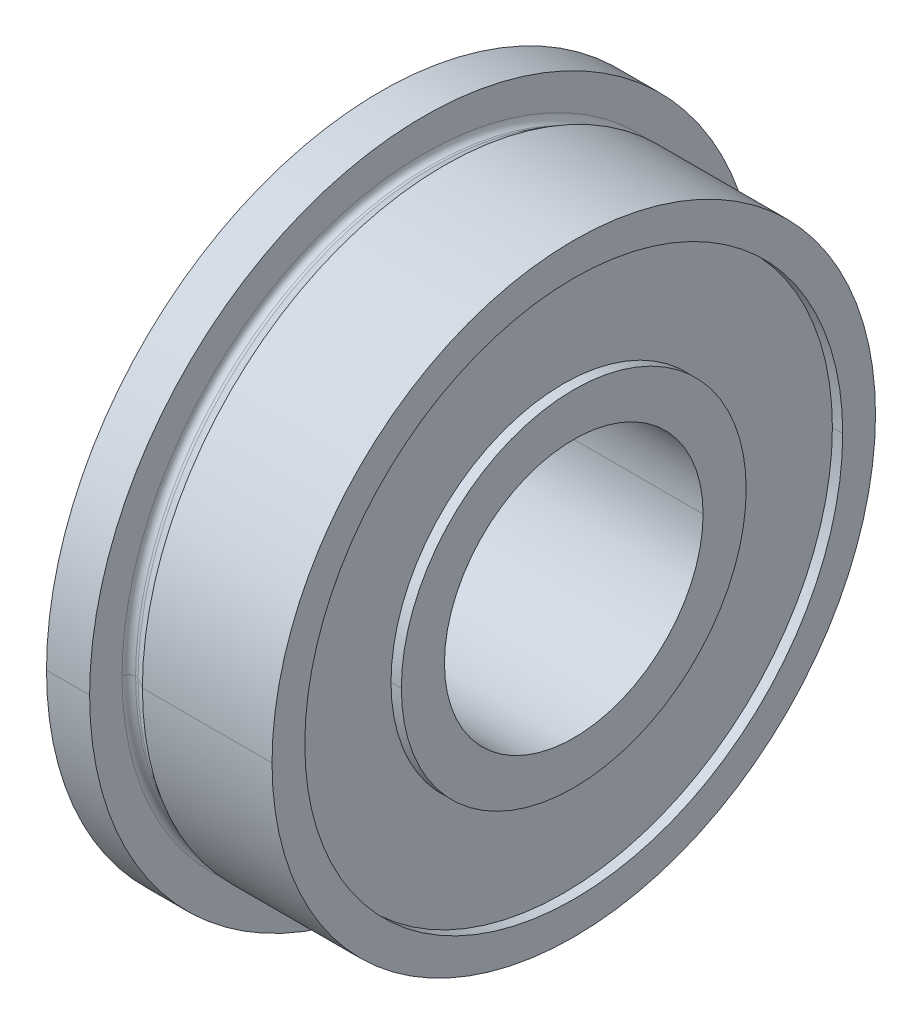
ISO-10303-21;
HEADER;
FILE_DESCRIPTION(('STEP AP214'),'2;1');
FILE_NAME('part.step','',(''),(''),'','','');
FILE_SCHEMA(('AUTOMOTIVE_DESIGN { 1 0 10303 214 1 1 1 1 }'));
ENDSEC;
DATA;
#1=APPLICATION_CONTEXT('core data for automotive mechanical design processes');
#2=APPLICATION_PROTOCOL_DEFINITION('international standard','automotive_design',2000,#1);
#3=PRODUCT_CONTEXT('',#1,'mechanical');
#4=PRODUCT('Part','Part','',(#3));
#5=PRODUCT_RELATED_PRODUCT_CATEGORY('part','',(#4));
#6=PRODUCT_DEFINITION_FORMATION('','',#4);
#7=PRODUCT_DEFINITION_CONTEXT('part definition',#1,'design');
#8=PRODUCT_DEFINITION('design','',#6,#7);
#9=PRODUCT_DEFINITION_SHAPE('','',#8);
#10=(LENGTH_UNIT() NAMED_UNIT(*) SI_UNIT(.MILLI.,.METRE.));
#11=(NAMED_UNIT(*) PLANE_ANGLE_UNIT() SI_UNIT($,.RADIAN.));
#12=(NAMED_UNIT(*) SI_UNIT($,.STERADIAN.) SOLID_ANGLE_UNIT());
#13=UNCERTAINTY_MEASURE_WITH_UNIT(LENGTH_MEASURE(1.E-05),#10,'distance_accuracy_value','');
#14=(GEOMETRIC_REPRESENTATION_CONTEXT(3) GLOBAL_UNCERTAINTY_ASSIGNED_CONTEXT((#13)) GLOBAL_UNIT_ASSIGNED_CONTEXT((#10,
#11,#12)) REPRESENTATION_CONTEXT('',''));
#15=CARTESIAN_POINT('',(0.,0.,0.));
#16=DIRECTION('',(0.,0.,1.));
#17=DIRECTION('',(1.,0.,0.));
#18=AXIS2_PLACEMENT_3D('',#15,#16,#17);
#19=CARTESIAN_POINT('',(1.8375,0.,0.));
#20=DIRECTION('',(-1.,0.,0.));
#21=DIRECTION('',(0.,0.,1.));
#22=AXIS2_PLACEMENT_3D('',#19,#20,#21);
#23=TOROIDAL_SURFACE('',#22,11.1125,0.25);
#24=CARTESIAN_POINT('',(1.8375,0.,11.1125));
#25=DIRECTION('',(0.,-1.,0.));
#26=DIRECTION('',(0.,0.,-1.));
#27=AXIS2_PLACEMENT_3D('',#24,#25,#26);
#28=CIRCLE('',#27,0.25);
#29=CARTESIAN_POINT('',(1.5875,0.,11.1125));
#30=VERTEX_POINT('',#29);
#31=CARTESIAN_POINT('',(1.8375,0.,10.8625));
#32=VERTEX_POINT('',#31);
#33=EDGE_CURVE('E11',#30,#32,#28,.T.);
#34=ORIENTED_EDGE('',*,*,#33,.T.);
#35=CARTESIAN_POINT('',(1.8375,0.,0.));
#36=DIRECTION('',(-1.,0.,0.));
#37=DIRECTION('',(0.,0.,1.));
#38=AXIS2_PLACEMENT_3D('',#35,#36,#37);
#39=CIRCLE('',#38,10.8625);
#40=CARTESIAN_POINT('',(1.8375,0.,-10.8625));
#41=VERTEX_POINT('',#40);
#42=EDGE_CURVE('E28',#32,#41,#39,.T.);
#43=ORIENTED_EDGE('',*,*,#42,.T.);
#44=CARTESIAN_POINT('',(1.8375,0.,-11.1125));
#45=DIRECTION('',(0.,1.,0.));
#46=DIRECTION('',(0.,0.,1.));
#47=AXIS2_PLACEMENT_3D('',#44,#45,#46);
#48=CIRCLE('',#47,0.25);
#49=CARTESIAN_POINT('',(1.5875,0.,-11.1125));
#50=VERTEX_POINT('',#49);
#51=EDGE_CURVE('E260',#50,#41,#48,.T.);
#52=ORIENTED_EDGE('',*,*,#51,.F.);
#53=CARTESIAN_POINT('',(1.5875,0.,0.));
#54=DIRECTION('',(-1.,0.,0.));
#55=DIRECTION('',(0.,0.,1.));
#56=AXIS2_PLACEMENT_3D('',#53,#54,#55);
#57=CIRCLE('',#56,11.1125);
#58=EDGE_CURVE('E230',#30,#50,#57,.T.);
#59=ORIENTED_EDGE('',*,*,#58,.F.);
#60=EDGE_LOOP('',(#34,#43,#52,#59));
#61=FACE_BOUND('',#60,.T.);
#62=ADVANCED_FACE('F17',(#61),#23,.F.);
#63=CARTESIAN_POINT('',(1.8375,0.,0.));
#64=DIRECTION('',(-1.,0.,0.));
#65=DIRECTION('',(0.,0.,1.));
#66=AXIS2_PLACEMENT_3D('',#63,#64,#65);
#67=TOROIDAL_SURFACE('',#66,11.1125,0.25);
#68=ORIENTED_EDGE('',*,*,#51,.T.);
#69=CARTESIAN_POINT('',(1.8375,0.,0.));
#70=DIRECTION('',(-1.,0.,0.));
#71=DIRECTION('',(0.,0.,1.));
#72=AXIS2_PLACEMENT_3D('',#69,#70,#71);
#73=CIRCLE('',#72,10.8625);
#74=EDGE_CURVE('E43',#41,#32,#73,.T.);
#75=ORIENTED_EDGE('',*,*,#74,.T.);
#76=ORIENTED_EDGE('',*,*,#33,.F.);
#77=CARTESIAN_POINT('',(1.5875,0.,0.));
#78=DIRECTION('',(-1.,0.,0.));
#79=DIRECTION('',(0.,0.,1.));
#80=AXIS2_PLACEMENT_3D('',#77,#78,#79);
#81=CIRCLE('',#80,11.1125);
#82=EDGE_CURVE('E239',#50,#30,#81,.T.);
#83=ORIENTED_EDGE('',*,*,#82,.F.);
#84=EDGE_LOOP('',(#68,#75,#76,#83));
#85=FACE_BOUND('',#84,.T.);
#86=ADVANCED_FACE('F677',(#85),#67,.F.);
#87=CARTESIAN_POINT('',(0.,0.,0.));
#88=DIRECTION('',(-1.,0.,0.));
#89=DIRECTION('',(0.,0.,1.));
#90=AXIS2_PLACEMENT_3D('',#87,#88,#89);
#91=CYLINDRICAL_SURFACE('',#90,6.35);
#92=CARTESIAN_POINT('',(0.381,0.,0.));
#93=DIRECTION('',(-1.,0.,0.));
#94=DIRECTION('',(0.,0.,1.));
#95=AXIS2_PLACEMENT_3D('',#92,#93,#94);
#96=CIRCLE('',#95,6.35);
#97=CARTESIAN_POINT('',(0.381,0.,6.35));
#98=VERTEX_POINT('',#97);
#99=CARTESIAN_POINT('',(0.381,0.,-6.35));
#100=VERTEX_POINT('',#99);
#101=EDGE_CURVE('E184',#98,#100,#96,.T.);
#102=ORIENTED_EDGE('',*,*,#101,.T.);
#103=DIRECTION('',(-1.,0.,0.));
#104=VECTOR('',#103,1.);
#105=CARTESIAN_POINT('',(0.,0.,-6.35));
#106=LINE('',#105,#104);
#107=CARTESIAN_POINT('',(0.,0.,-6.35));
#108=VERTEX_POINT('',#107);
#109=EDGE_CURVE('E180',#100,#108,#106,.T.);
#110=ORIENTED_EDGE('',*,*,#109,.T.);
#111=CARTESIAN_POINT('',(0.,0.,0.));
#112=DIRECTION('',(-1.,0.,0.));
#113=DIRECTION('',(0.,0.,1.));
#114=AXIS2_PLACEMENT_3D('',#111,#112,#113);
#115=CIRCLE('',#114,6.35);
#116=CARTESIAN_POINT('',(0.,0.,6.35));
#117=VERTEX_POINT('',#116);
#118=EDGE_CURVE('E306',#117,#108,#115,.T.);
#119=ORIENTED_EDGE('',*,*,#118,.F.);
#120=DIRECTION('',(-1.,0.,0.));
#121=VECTOR('',#120,1.);
#122=CARTESIAN_POINT('',(0.,0.,6.35));
#123=LINE('',#122,#121);
#124=EDGE_CURVE('E208',#98,#117,#123,.T.);
#125=ORIENTED_EDGE('',*,*,#124,.F.);
#126=EDGE_LOOP('',(#102,#110,#119,#125));
#127=FACE_BOUND('',#126,.T.);
#128=ADVANCED_FACE('F348',(#127),#91,.T.);
#129=CARTESIAN_POINT('',(0.,0.,0.));
#130=DIRECTION('',(-1.,0.,0.));
#131=DIRECTION('',(0.,0.,1.));
#132=AXIS2_PLACEMENT_3D('',#129,#130,#131);
#133=CYLINDRICAL_SURFACE('',#132,9.906);
#134=CARTESIAN_POINT('',(0.381,0.,0.));
#135=DIRECTION('',(-1.,0.,0.));
#136=DIRECTION('',(0.,0.,1.));
#137=AXIS2_PLACEMENT_3D('',#134,#135,#136);
#138=CIRCLE('',#137,9.906);
#139=CARTESIAN_POINT('',(0.381,0.,-9.906));
#140=VERTEX_POINT('',#139);
#141=CARTESIAN_POINT('',(0.381,0.,9.906));
#142=VERTEX_POINT('',#141);
#143=EDGE_CURVE('E218',#140,#142,#138,.T.);
#144=ORIENTED_EDGE('',*,*,#143,.F.);
#145=DIRECTION('',(-1.,0.,0.));
#146=VECTOR('',#145,1.);
#147=CARTESIAN_POINT('',(0.,0.,-9.906));
#148=LINE('',#147,#146);
#149=CARTESIAN_POINT('',(0.,0.,-9.906));
#150=VERTEX_POINT('',#149);
#151=EDGE_CURVE('E185',#140,#150,#148,.T.);
#152=ORIENTED_EDGE('',*,*,#151,.T.);
#153=CARTESIAN_POINT('',(0.,0.,0.));
#154=DIRECTION('',(-1.,0.,0.));
#155=DIRECTION('',(0.,0.,1.));
#156=AXIS2_PLACEMENT_3D('',#153,#154,#155);
#157=CIRCLE('',#156,9.906);
#158=CARTESIAN_POINT('',(0.,0.,9.906));
#159=VERTEX_POINT('',#158);
#160=EDGE_CURVE('E178',#150,#159,#157,.T.);
#161=ORIENTED_EDGE('',*,*,#160,.T.);
#162=DIRECTION('',(-1.,0.,0.));
#163=VECTOR('',#162,1.);
#164=CARTESIAN_POINT('',(0.,0.,9.906));
#165=LINE('',#164,#163);
#166=EDGE_CURVE('E234',#142,#159,#165,.T.);
#167=ORIENTED_EDGE('',*,*,#166,.F.);
#168=EDGE_LOOP('',(#144,#152,#161,#167));
#169=FACE_BOUND('',#168,.T.);
#170=ADVANCED_FACE('F557',(#169),#133,.F.);
#171=CARTESIAN_POINT('',(0.,0.,0.));
#172=DIRECTION('',(-1.,0.,0.));
#173=DIRECTION('',(0.,0.,1.));
#174=AXIS2_PLACEMENT_3D('',#171,#172,#173);
#175=CYLINDRICAL_SURFACE('',#174,12.3063);
#176=CARTESIAN_POINT('',(1.5875,0.,0.));
#177=DIRECTION('',(-1.,0.,0.));
#178=DIRECTION('',(0.,0.,1.));
#179=AXIS2_PLACEMENT_3D('',#176,#177,#178);
#180=CIRCLE('',#179,12.3063);
#181=CARTESIAN_POINT('',(1.5875,0.,12.3063));
#182=VERTEX_POINT('',#181);
#183=CARTESIAN_POINT('',(1.5875,0.,-12.3063));
#184=VERTEX_POINT('',#183);
#185=EDGE_CURVE('E174',#182,#184,#180,.T.);
#186=ORIENTED_EDGE('',*,*,#185,.T.);
#187=DIRECTION('',(-1.,0.,0.));
#188=VECTOR('',#187,1.);
#189=CARTESIAN_POINT('',(0.,0.,-12.3063));
#190=LINE('',#189,#188);
#191=CARTESIAN_POINT('',(0.,0.,-12.3063));
#192=VERTEX_POINT('',#191);
#193=EDGE_CURVE('E179',#184,#192,#190,.T.);
#194=ORIENTED_EDGE('',*,*,#193,.T.);
#195=CARTESIAN_POINT('',(0.,0.,0.));
#196=DIRECTION('',(-1.,0.,0.));
#197=DIRECTION('',(0.,0.,1.));
#198=AXIS2_PLACEMENT_3D('',#195,#196,#197);
#199=CIRCLE('',#198,12.3063);
#200=CARTESIAN_POINT('',(0.,0.,12.3063));
#201=VERTEX_POINT('',#200);
#202=EDGE_CURVE('E200',#201,#192,#199,.T.);
#203=ORIENTED_EDGE('',*,*,#202,.F.);
#204=DIRECTION('',(-1.,0.,0.));
#205=VECTOR('',#204,1.);
#206=CARTESIAN_POINT('',(0.,0.,12.3063));
#207=LINE('',#206,#205);
#208=EDGE_CURVE('E203',#182,#201,#207,.T.);
#209=ORIENTED_EDGE('',*,*,#208,.F.);
#210=EDGE_LOOP('',(#186,#194,#203,#209));
#211=FACE_BOUND('',#210,.T.);
#212=ADVANCED_FACE('F562',(#211),#175,.T.);
#213=CARTESIAN_POINT('',(1.8375,0.,0.));
#214=DIRECTION('',(-1.,0.,0.));
#215=DIRECTION('',(0.,0.,1.));
#216=AXIS2_PLACEMENT_3D('',#213,#214,#215);
#217=TOROIDAL_SURFACE('',#216,11.1125,0.25);
#218=ORIENTED_EDGE('',*,*,#74,.F.);
#219=CARTESIAN_POINT('',(1.8375,0.,-11.1125));
#220=DIRECTION('',(0.,1.,0.));
#221=DIRECTION('',(0.,0.,1.));
#222=AXIS2_PLACEMENT_3D('',#219,#220,#221);
#223=CIRCLE('',#222,0.25);
#224=CARTESIAN_POINT('',(1.9625,0.,-10.8959936490539));
#225=VERTEX_POINT('',#224);
#226=EDGE_CURVE('E258',#41,#225,#223,.T.);
#227=ORIENTED_EDGE('',*,*,#226,.T.);
#228=CARTESIAN_POINT('',(1.9625,0.,0.));
#229=DIRECTION('',(-1.,0.,0.));
#230=DIRECTION('',(0.,0.,1.));
#231=AXIS2_PLACEMENT_3D('',#228,#229,#230);
#232=CIRCLE('',#231,10.8959936490539);
#233=CARTESIAN_POINT('',(1.9625,0.,10.8959936490539));
#234=VERTEX_POINT('',#233);
#235=EDGE_CURVE('E279',#225,#234,#232,.T.);
#236=ORIENTED_EDGE('',*,*,#235,.T.);
#237=CARTESIAN_POINT('',(1.8375,0.,11.1125));
#238=DIRECTION('',(0.,-1.,0.));
#239=DIRECTION('',(0.,0.,-1.));
#240=AXIS2_PLACEMENT_3D('',#237,#238,#239);
#241=CIRCLE('',#240,0.25);
#242=EDGE_CURVE('E217',#32,#234,#241,.T.);
#243=ORIENTED_EDGE('',*,*,#242,.F.);
#244=EDGE_LOOP('',(#218,#227,#236,#243));
#245=FACE_BOUND('',#244,.T.);
#246=ADVANCED_FACE('F648',(#245),#217,.F.);
#247=CARTESIAN_POINT('',(2.3375,0.,0.));
#248=DIRECTION('',(1.,0.,0.));
#249=DIRECTION('',(0.,0.,-1.));
#250=AXIS2_PLACEMENT_3D('',#247,#248,#249);
#251=CONICAL_SURFACE('',#250,11.1125,0.523598775598299);
#252=CARTESIAN_POINT('',(1.9625,0.,0.));
#253=DIRECTION('',(-1.,0.,0.));
#254=DIRECTION('',(0.,0.,1.));
#255=AXIS2_PLACEMENT_3D('',#252,#253,#254);
#256=CIRCLE('',#255,10.8959936490539);
#257=EDGE_CURVE('E226',#234,#225,#256,.T.);
#258=ORIENTED_EDGE('',*,*,#257,.F.);
#259=DIRECTION('',(0.866025403784438,0.,0.5));
#260=VECTOR('',#259,1.);
#261=CARTESIAN_POINT('',(2.3375,0.,11.1125));
#262=LINE('',#261,#260);
#263=CARTESIAN_POINT('',(2.3375,0.,11.1125));
#264=VERTEX_POINT('',#263);
#265=EDGE_CURVE('E214',#234,#264,#262,.T.);
#266=ORIENTED_EDGE('',*,*,#265,.T.);
#267=CARTESIAN_POINT('',(2.3375,0.,0.));
#268=DIRECTION('',(-1.,0.,0.));
#269=DIRECTION('',(0.,0.,1.));
#270=AXIS2_PLACEMENT_3D('',#267,#268,#269);
#271=CIRCLE('',#270,11.1125);
#272=CARTESIAN_POINT('',(2.3375,0.,-11.1125));
#273=VERTEX_POINT('',#272);
#274=EDGE_CURVE('E150',#264,#273,#271,.T.);
#275=ORIENTED_EDGE('',*,*,#274,.T.);
#276=DIRECTION('',(0.866025403784438,0.,-0.5));
#277=VECTOR('',#276,1.);
#278=CARTESIAN_POINT('',(2.3375,0.,-11.1125));
#279=LINE('',#278,#277);
#280=EDGE_CURVE('E21',#225,#273,#279,.T.);
#281=ORIENTED_EDGE('',*,*,#280,.F.);
#282=EDGE_LOOP('',(#258,#266,#275,#281));
#283=FACE_BOUND('',#282,.T.);
#284=ADVANCED_FACE('F670',(#283),#251,.T.);
#285=CARTESIAN_POINT('',(0.,0.,0.));
#286=DIRECTION('',(-1.,0.,0.));
#287=DIRECTION('',(0.,0.,1.));
#288=AXIS2_PLACEMENT_3D('',#285,#286,#287);
#289=CYLINDRICAL_SURFACE('',#288,11.1125);
#290=CARTESIAN_POINT('',(7.112,0.,0.));
#291=DIRECTION('',(-1.,0.,0.));
#292=DIRECTION('',(0.,0.,1.));
#293=AXIS2_PLACEMENT_3D('',#290,#291,#292);
#294=CIRCLE('',#293,11.1125);
#295=CARTESIAN_POINT('',(7.112,0.,11.1125));
#296=VERTEX_POINT('',#295);
#297=CARTESIAN_POINT('',(7.112,0.,-11.1125));
#298=VERTEX_POINT('',#297);
#299=EDGE_CURVE('E143',#296,#298,#294,.T.);
#300=ORIENTED_EDGE('',*,*,#299,.T.);
#301=DIRECTION('',(-1.,0.,0.));
#302=VECTOR('',#301,1.);
#303=CARTESIAN_POINT('',(0.,0.,-11.1125));
#304=LINE('',#303,#302);
#305=EDGE_CURVE('E132',#298,#273,#304,.T.);
#306=ORIENTED_EDGE('',*,*,#305,.T.);
#307=ORIENTED_EDGE('',*,*,#274,.F.);
#308=DIRECTION('',(-1.,0.,0.));
#309=VECTOR('',#308,1.);
#310=CARTESIAN_POINT('',(0.,0.,11.1125));
#311=LINE('',#310,#309);
#312=EDGE_CURVE('E147',#296,#264,#311,.T.);
#313=ORIENTED_EDGE('',*,*,#312,.F.);
#314=EDGE_LOOP('',(#300,#306,#307,#313));
#315=FACE_BOUND('',#314,.T.);
#316=ADVANCED_FACE('F146',(#315),#289,.T.);
#317=CARTESIAN_POINT('',(0.,0.,0.));
#318=DIRECTION('',(-1.,0.,0.));
#319=DIRECTION('',(0.,0.,1.));
#320=AXIS2_PLACEMENT_3D('',#317,#318,#319);
#321=CYLINDRICAL_SURFACE('',#320,9.906);
#322=CARTESIAN_POINT('',(7.112,0.,0.));
#323=DIRECTION('',(-1.,0.,0.));
#324=DIRECTION('',(0.,0.,1.));
#325=AXIS2_PLACEMENT_3D('',#322,#323,#324);
#326=CIRCLE('',#325,9.906);
#327=CARTESIAN_POINT('',(7.112,0.,-9.906));
#328=VERTEX_POINT('',#327);
#329=CARTESIAN_POINT('',(7.112,0.,9.906));
#330=VERTEX_POINT('',#329);
#331=EDGE_CURVE('E154',#328,#330,#326,.T.);
#332=ORIENTED_EDGE('',*,*,#331,.F.);
#333=DIRECTION('',(-1.,0.,0.));
#334=VECTOR('',#333,1.);
#335=CARTESIAN_POINT('',(0.,0.,-9.906));
#336=LINE('',#335,#334);
#337=CARTESIAN_POINT('',(6.731,0.,-9.906));
#338=VERTEX_POINT('',#337);
#339=EDGE_CURVE('E144',#328,#338,#336,.T.);
#340=ORIENTED_EDGE('',*,*,#339,.T.);
#341=CARTESIAN_POINT('',(6.731,0.,0.));
#342=DIRECTION('',(-1.,0.,0.));
#343=DIRECTION('',(0.,0.,1.));
#344=AXIS2_PLACEMENT_3D('',#341,#342,#343);
#345=CIRCLE('',#344,9.906);
#346=CARTESIAN_POINT('',(6.731,0.,9.906));
#347=VERTEX_POINT('',#346);
#348=EDGE_CURVE('E172',#338,#347,#345,.T.);
#349=ORIENTED_EDGE('',*,*,#348,.T.);
#350=DIRECTION('',(-1.,0.,0.));
#351=VECTOR('',#350,1.);
#352=CARTESIAN_POINT('',(0.,0.,9.906));
#353=LINE('',#352,#351);
#354=EDGE_CURVE('E186',#330,#347,#353,.T.);
#355=ORIENTED_EDGE('',*,*,#354,.F.);
#356=EDGE_LOOP('',(#332,#340,#349,#355));
#357=FACE_BOUND('',#356,.T.);
#358=ADVANCED_FACE('F659',(#357),#321,.F.);
#359=CARTESIAN_POINT('',(0.,0.,0.));
#360=DIRECTION('',(-1.,0.,0.));
#361=DIRECTION('',(0.,0.,1.));
#362=AXIS2_PLACEMENT_3D('',#359,#360,#361);
#363=CYLINDRICAL_SURFACE('',#362,6.35);
#364=CARTESIAN_POINT('',(7.112,0.,0.));
#365=DIRECTION('',(-1.,0.,0.));
#366=DIRECTION('',(0.,0.,1.));
#367=AXIS2_PLACEMENT_3D('',#364,#365,#366);
#368=CIRCLE('',#367,6.35);
#369=CARTESIAN_POINT('',(7.112,0.,6.35));
#370=VERTEX_POINT('',#369);
#371=CARTESIAN_POINT('',(7.112,0.,-6.35));
#372=VERTEX_POINT('',#371);
#373=EDGE_CURVE('E168',#370,#372,#368,.T.);
#374=ORIENTED_EDGE('',*,*,#373,.T.);
#375=DIRECTION('',(-1.,0.,0.));
#376=VECTOR('',#375,1.);
#377=CARTESIAN_POINT('',(0.,0.,-6.35));
#378=LINE('',#377,#376);
#379=CARTESIAN_POINT('',(6.731,0.,-6.35));
#380=VERTEX_POINT('',#379);
#381=EDGE_CURVE('E173',#372,#380,#378,.T.);
#382=ORIENTED_EDGE('',*,*,#381,.T.);
#383=CARTESIAN_POINT('',(6.731,0.,0.));
#384=DIRECTION('',(-1.,0.,0.));
#385=DIRECTION('',(0.,0.,1.));
#386=AXIS2_PLACEMENT_3D('',#383,#384,#385);
#387=CIRCLE('',#386,6.35);
#388=CARTESIAN_POINT('',(6.731,0.,6.35));
#389=VERTEX_POINT('',#388);
#390=EDGE_CURVE('E199',#389,#380,#387,.T.);
#391=ORIENTED_EDGE('',*,*,#390,.F.);
#392=DIRECTION('',(-1.,0.,0.));
#393=VECTOR('',#392,1.);
#394=CARTESIAN_POINT('',(0.,0.,6.35));
#395=LINE('',#394,#393);
#396=EDGE_CURVE('E194',#370,#389,#395,.T.);
#397=ORIENTED_EDGE('',*,*,#396,.F.);
#398=EDGE_LOOP('',(#374,#382,#391,#397));
#399=FACE_BOUND('',#398,.T.);
#400=ADVANCED_FACE('F576',(#399),#363,.T.);
#401=CARTESIAN_POINT('',(0.,0.,0.));
#402=DIRECTION('',(-1.,0.,0.));
#403=DIRECTION('',(0.,0.,1.));
#404=AXIS2_PLACEMENT_3D('',#401,#402,#403);
#405=CYLINDRICAL_SURFACE('',#404,4.7625);
#406=CARTESIAN_POINT('',(7.112,0.,0.));
#407=DIRECTION('',(-1.,0.,0.));
#408=DIRECTION('',(0.,0.,1.));
#409=AXIS2_PLACEMENT_3D('',#406,#407,#408);
#410=CIRCLE('',#409,4.7625);
#411=CARTESIAN_POINT('',(7.112,0.,-4.7625));
#412=VERTEX_POINT('',#411);
#413=CARTESIAN_POINT('',(7.112,0.,4.7625));
#414=VERTEX_POINT('',#413);
#415=EDGE_CURVE('E71',#412,#414,#410,.T.);
#416=ORIENTED_EDGE('',*,*,#415,.F.);
#417=DIRECTION('',(-1.,0.,0.));
#418=VECTOR('',#417,1.);
#419=CARTESIAN_POINT('',(0.,0.,-4.7625));
#420=LINE('',#419,#418);
#421=CARTESIAN_POINT('',(0.,0.,-4.7625));
#422=VERTEX_POINT('',#421);
#423=EDGE_CURVE('E305',#412,#422,#420,.T.);
#424=ORIENTED_EDGE('',*,*,#423,.T.);
#425=CARTESIAN_POINT('',(0.,0.,0.));
#426=DIRECTION('',(-1.,0.,0.));
#427=DIRECTION('',(0.,0.,1.));
#428=AXIS2_PLACEMENT_3D('',#425,#426,#427);
#429=CIRCLE('',#428,4.7625);
#430=CARTESIAN_POINT('',(0.,0.,4.7625));
#431=VERTEX_POINT('',#430);
#432=EDGE_CURVE('E302',#422,#431,#429,.T.);
#433=ORIENTED_EDGE('',*,*,#432,.T.);
#434=DIRECTION('',(-1.,0.,0.));
#435=VECTOR('',#434,1.);
#436=CARTESIAN_POINT('',(0.,0.,4.7625));
#437=LINE('',#436,#435);
#438=EDGE_CURVE('E84',#414,#431,#437,.T.);
#439=ORIENTED_EDGE('',*,*,#438,.F.);
#440=EDGE_LOOP('',(#416,#424,#433,#439));
#441=FACE_BOUND('',#440,.T.);
#442=ADVANCED_FACE('F571',(#441),#405,.F.);
#443=CARTESIAN_POINT('',(0.,6.35,0.));
#444=DIRECTION('',(1.,0.,0.));
#445=DIRECTION('',(0.,1.,0.));
#446=AXIS2_PLACEMENT_3D('',#443,#444,#445);
#447=PLANE('',#446);
#448=ORIENTED_EDGE('',*,*,#118,.T.);
#449=CARTESIAN_POINT('',(0.,0.,0.));
#450=DIRECTION('',(-1.,0.,0.));
#451=DIRECTION('',(0.,0.,1.));
#452=AXIS2_PLACEMENT_3D('',#449,#450,#451);
#453=CIRCLE('',#452,6.35);
#454=EDGE_CURVE('E225',#108,#117,#453,.T.);
#455=ORIENTED_EDGE('',*,*,#454,.T.);
#456=EDGE_LOOP('',(#448,#455));
#457=FACE_BOUND('',#456,.T.);
#458=CARTESIAN_POINT('',(0.,0.,0.));
#459=DIRECTION('',(-1.,0.,0.));
#460=DIRECTION('',(0.,0.,1.));
#461=AXIS2_PLACEMENT_3D('',#458,#459,#460);
#462=CIRCLE('',#461,4.7625);
#463=EDGE_CURVE('E166',#431,#422,#462,.T.);
#464=ORIENTED_EDGE('',*,*,#463,.F.);
#465=ORIENTED_EDGE('',*,*,#432,.F.);
#466=EDGE_LOOP('',(#464,#465));
#467=FACE_BOUND('',#466,.T.);
#468=ADVANCED_FACE('F339',(#457,#467),#447,.F.);
#469=CARTESIAN_POINT('',(0.,0.,0.));
#470=DIRECTION('',(-1.,0.,0.));
#471=DIRECTION('',(0.,0.,1.));
#472=AXIS2_PLACEMENT_3D('',#469,#470,#471);
#473=CYLINDRICAL_SURFACE('',#472,4.7625);
#474=ORIENTED_EDGE('',*,*,#423,.F.);
#475=CARTESIAN_POINT('',(7.112,0.,0.));
#476=DIRECTION('',(-1.,0.,0.));
#477=DIRECTION('',(0.,0.,1.));
#478=AXIS2_PLACEMENT_3D('',#475,#476,#477);
#479=CIRCLE('',#478,4.7625);
#480=EDGE_CURVE('E272',#414,#412,#479,.T.);
#481=ORIENTED_EDGE('',*,*,#480,.F.);
#482=ORIENTED_EDGE('',*,*,#438,.T.);
#483=ORIENTED_EDGE('',*,*,#463,.T.);
#484=EDGE_LOOP('',(#474,#481,#482,#483));
#485=FACE_BOUND('',#484,.T.);
#486=ADVANCED_FACE('F604',(#485),#473,.F.);
#487=CARTESIAN_POINT('',(7.112,4.7625,0.));
#488=DIRECTION('',(-1.,0.,0.));
#489=DIRECTION('',(0.,0.,1.));
#490=AXIS2_PLACEMENT_3D('',#487,#488,#489);
#491=PLANE('',#490);
#492=ORIENTED_EDGE('',*,*,#373,.F.);
#493=CARTESIAN_POINT('',(7.112,0.,0.));
#494=DIRECTION('',(-1.,0.,0.));
#495=DIRECTION('',(0.,0.,1.));
#496=AXIS2_PLACEMENT_3D('',#493,#494,#495);
#497=CIRCLE('',#496,6.35);
#498=EDGE_CURVE('E198',#372,#370,#497,.T.);
#499=ORIENTED_EDGE('',*,*,#498,.F.);
#500=EDGE_LOOP('',(#492,#499));
#501=FACE_BOUND('',#500,.T.);
#502=ORIENTED_EDGE('',*,*,#480,.T.);
#503=ORIENTED_EDGE('',*,*,#415,.T.);
#504=EDGE_LOOP('',(#502,#503));
#505=FACE_BOUND('',#504,.T.);
#506=ADVANCED_FACE('F598',(#501,#505),#491,.F.);
#507=CARTESIAN_POINT('',(0.,0.,0.));
#508=DIRECTION('',(-1.,0.,0.));
#509=DIRECTION('',(0.,0.,1.));
#510=AXIS2_PLACEMENT_3D('',#507,#508,#509);
#511=CYLINDRICAL_SURFACE('',#510,6.35);
#512=ORIENTED_EDGE('',*,*,#381,.F.);
#513=ORIENTED_EDGE('',*,*,#498,.T.);
#514=ORIENTED_EDGE('',*,*,#396,.T.);
#515=CARTESIAN_POINT('',(6.731,0.,0.));
#516=DIRECTION('',(-1.,0.,0.));
#517=DIRECTION('',(0.,0.,1.));
#518=AXIS2_PLACEMENT_3D('',#515,#516,#517);
#519=CIRCLE('',#518,6.35);
#520=EDGE_CURVE('E189',#380,#389,#519,.T.);
#521=ORIENTED_EDGE('',*,*,#520,.F.);
#522=EDGE_LOOP('',(#512,#513,#514,#521));
#523=FACE_BOUND('',#522,.T.);
#524=ADVANCED_FACE('F603',(#523),#511,.T.);
#525=CARTESIAN_POINT('',(6.731,9.906,0.));
#526=DIRECTION('',(-1.,0.,0.));
#527=DIRECTION('',(0.,0.,1.));
#528=AXIS2_PLACEMENT_3D('',#525,#526,#527);
#529=PLANE('',#528);
#530=CARTESIAN_POINT('',(6.731,0.,0.));
#531=DIRECTION('',(-1.,0.,0.));
#532=DIRECTION('',(0.,0.,1.));
#533=AXIS2_PLACEMENT_3D('',#530,#531,#532);
#534=CIRCLE('',#533,9.906);
#535=EDGE_CURVE('E190',#347,#338,#534,.T.);
#536=ORIENTED_EDGE('',*,*,#535,.F.);
#537=ORIENTED_EDGE('',*,*,#348,.F.);
#538=EDGE_LOOP('',(#536,#537));
#539=FACE_BOUND('',#538,.T.);
#540=ORIENTED_EDGE('',*,*,#390,.T.);
#541=ORIENTED_EDGE('',*,*,#520,.T.);
#542=EDGE_LOOP('',(#540,#541));
#543=FACE_BOUND('',#542,.T.);
#544=ADVANCED_FACE('F548',(#539,#543),#529,.F.);
#545=CARTESIAN_POINT('',(0.,0.,0.));
#546=DIRECTION('',(-1.,0.,0.));
#547=DIRECTION('',(0.,0.,1.));
#548=AXIS2_PLACEMENT_3D('',#545,#546,#547);
#549=CYLINDRICAL_SURFACE('',#548,9.906);
#550=ORIENTED_EDGE('',*,*,#339,.F.);
#551=CARTESIAN_POINT('',(7.112,0.,0.));
#552=DIRECTION('',(-1.,0.,0.));
#553=DIRECTION('',(0.,0.,1.));
#554=AXIS2_PLACEMENT_3D('',#551,#552,#553);
#555=CIRCLE('',#554,9.906);
#556=EDGE_CURVE('E161',#330,#328,#555,.T.);
#557=ORIENTED_EDGE('',*,*,#556,.F.);
#558=ORIENTED_EDGE('',*,*,#354,.T.);
#559=ORIENTED_EDGE('',*,*,#535,.T.);
#560=EDGE_LOOP('',(#550,#557,#558,#559));
#561=FACE_BOUND('',#560,.T.);
#562=ADVANCED_FACE('F543',(#561),#549,.F.);
#563=CARTESIAN_POINT('',(7.112,9.906,0.));
#564=DIRECTION('',(-1.,0.,0.));
#565=DIRECTION('',(0.,0.,1.));
#566=AXIS2_PLACEMENT_3D('',#563,#564,#565);
#567=PLANE('',#566);
#568=ORIENTED_EDGE('',*,*,#299,.F.);
#569=CARTESIAN_POINT('',(7.112,0.,0.));
#570=DIRECTION('',(-1.,0.,0.));
#571=DIRECTION('',(0.,0.,1.));
#572=AXIS2_PLACEMENT_3D('',#569,#570,#571);
#573=CIRCLE('',#572,11.1125);
#574=EDGE_CURVE('E136',#298,#296,#573,.T.);
#575=ORIENTED_EDGE('',*,*,#574,.F.);
#576=EDGE_LOOP('',(#568,#575));
#577=FACE_BOUND('',#576,.T.);
#578=ORIENTED_EDGE('',*,*,#556,.T.);
#579=ORIENTED_EDGE('',*,*,#331,.T.);
#580=EDGE_LOOP('',(#578,#579));
#581=FACE_BOUND('',#580,.T.);
#582=ADVANCED_FACE('F19',(#577,#581),#567,.F.);
#583=CARTESIAN_POINT('',(0.,0.,0.));
#584=DIRECTION('',(-1.,0.,0.));
#585=DIRECTION('',(0.,0.,1.));
#586=AXIS2_PLACEMENT_3D('',#583,#584,#585);
#587=CYLINDRICAL_SURFACE('',#586,11.1125);
#588=ORIENTED_EDGE('',*,*,#305,.F.);
#589=ORIENTED_EDGE('',*,*,#574,.T.);
#590=ORIENTED_EDGE('',*,*,#312,.T.);
#591=CARTESIAN_POINT('',(2.3375,0.,0.));
#592=DIRECTION('',(-1.,0.,0.));
#593=DIRECTION('',(0.,0.,1.));
#594=AXIS2_PLACEMENT_3D('',#591,#592,#593);
#595=CIRCLE('',#594,11.1125);
#596=EDGE_CURVE('E138',#273,#264,#595,.T.);
#597=ORIENTED_EDGE('',*,*,#596,.F.);
#598=EDGE_LOOP('',(#588,#589,#590,#597));
#599=FACE_BOUND('',#598,.T.);
#600=ADVANCED_FACE('F134',(#599),#587,.T.);
#601=CARTESIAN_POINT('',(2.3375,0.,0.));
#602=DIRECTION('',(1.,0.,0.));
#603=DIRECTION('',(0.,0.,-1.));
#604=AXIS2_PLACEMENT_3D('',#601,#602,#603);
#605=CONICAL_SURFACE('',#604,11.1125,0.523598775598299);
#606=ORIENTED_EDGE('',*,*,#265,.F.);
#607=ORIENTED_EDGE('',*,*,#235,.F.);
#608=ORIENTED_EDGE('',*,*,#280,.T.);
#609=ORIENTED_EDGE('',*,*,#596,.T.);
#610=EDGE_LOOP('',(#606,#607,#608,#609));
#611=FACE_BOUND('',#610,.T.);
#612=ADVANCED_FACE('F612',(#611),#605,.T.);
#613=CARTESIAN_POINT('',(1.8375,0.,0.));
#614=DIRECTION('',(-1.,0.,0.));
#615=DIRECTION('',(0.,0.,1.));
#616=AXIS2_PLACEMENT_3D('',#613,#614,#615);
#617=TOROIDAL_SURFACE('',#616,11.1125,0.25);
#618=ORIENTED_EDGE('',*,*,#42,.F.);
#619=ORIENTED_EDGE('',*,*,#242,.T.);
#620=ORIENTED_EDGE('',*,*,#257,.T.);
#621=ORIENTED_EDGE('',*,*,#226,.F.);
#622=EDGE_LOOP('',(#618,#619,#620,#621));
#623=FACE_BOUND('',#622,.T.);
#624=ADVANCED_FACE('F617',(#623),#617,.F.);
#625=CARTESIAN_POINT('',(1.5875,11.1125,0.));
#626=DIRECTION('',(-1.,0.,0.));
#627=DIRECTION('',(0.,0.,1.));
#628=AXIS2_PLACEMENT_3D('',#625,#626,#627);
#629=PLANE('',#628);
#630=ORIENTED_EDGE('',*,*,#185,.F.);
#631=CARTESIAN_POINT('',(1.5875,0.,0.));
#632=DIRECTION('',(-1.,0.,0.));
#633=DIRECTION('',(0.,0.,1.));
#634=AXIS2_PLACEMENT_3D('',#631,#632,#633);
#635=CIRCLE('',#634,12.3063);
#636=EDGE_CURVE('E235',#184,#182,#635,.T.);
#637=ORIENTED_EDGE('',*,*,#636,.F.);
#638=EDGE_LOOP('',(#630,#637));
#639=FACE_BOUND('',#638,.T.);
#640=ORIENTED_EDGE('',*,*,#58,.T.);
#641=ORIENTED_EDGE('',*,*,#82,.T.);
#642=EDGE_LOOP('',(#640,#641));
#643=FACE_BOUND('',#642,.T.);
#644=ADVANCED_FACE('F699',(#639,#643),#629,.F.);
#645=CARTESIAN_POINT('',(0.,0.,0.));
#646=DIRECTION('',(-1.,0.,0.));
#647=DIRECTION('',(0.,0.,1.));
#648=AXIS2_PLACEMENT_3D('',#645,#646,#647);
#649=CYLINDRICAL_SURFACE('',#648,12.3063);
#650=ORIENTED_EDGE('',*,*,#193,.F.);
#651=ORIENTED_EDGE('',*,*,#636,.T.);
#652=ORIENTED_EDGE('',*,*,#208,.T.);
#653=CARTESIAN_POINT('',(0.,0.,0.));
#654=DIRECTION('',(-1.,0.,0.));
#655=DIRECTION('',(0.,0.,1.));
#656=AXIS2_PLACEMENT_3D('',#653,#654,#655);
#657=CIRCLE('',#656,12.3063);
#658=EDGE_CURVE('E204',#192,#201,#657,.T.);
#659=ORIENTED_EDGE('',*,*,#658,.F.);
#660=EDGE_LOOP('',(#650,#651,#652,#659));
#661=FACE_BOUND('',#660,.T.);
#662=ADVANCED_FACE('F637',(#661),#649,.T.);
#663=CARTESIAN_POINT('',(0.,12.3063,0.));
#664=DIRECTION('',(1.,0.,0.));
#665=DIRECTION('',(0.,1.,0.));
#666=AXIS2_PLACEMENT_3D('',#663,#664,#665);
#667=PLANE('',#666);
#668=ORIENTED_EDGE('',*,*,#202,.T.);
#669=ORIENTED_EDGE('',*,*,#658,.T.);
#670=EDGE_LOOP('',(#668,#669));
#671=FACE_BOUND('',#670,.T.);
#672=CARTESIAN_POINT('',(0.,0.,0.));
#673=DIRECTION('',(-1.,0.,0.));
#674=DIRECTION('',(0.,0.,1.));
#675=AXIS2_PLACEMENT_3D('',#672,#673,#674);
#676=CIRCLE('',#675,9.906);
#677=EDGE_CURVE('E270',#159,#150,#676,.T.);
#678=ORIENTED_EDGE('',*,*,#677,.F.);
#679=ORIENTED_EDGE('',*,*,#160,.F.);
#680=EDGE_LOOP('',(#678,#679));
#681=FACE_BOUND('',#680,.T.);
#682=ADVANCED_FACE('F590',(#671,#681),#667,.F.);
#683=CARTESIAN_POINT('',(0.,0.,0.));
#684=DIRECTION('',(-1.,0.,0.));
#685=DIRECTION('',(0.,0.,1.));
#686=AXIS2_PLACEMENT_3D('',#683,#684,#685);
#687=CYLINDRICAL_SURFACE('',#686,9.906);
#688=ORIENTED_EDGE('',*,*,#151,.F.);
#689=CARTESIAN_POINT('',(0.381,0.,0.));
#690=DIRECTION('',(-1.,0.,0.));
#691=DIRECTION('',(0.,0.,1.));
#692=AXIS2_PLACEMENT_3D('',#689,#690,#691);
#693=CIRCLE('',#692,9.906);
#694=EDGE_CURVE('E222',#142,#140,#693,.T.);
#695=ORIENTED_EDGE('',*,*,#694,.F.);
#696=ORIENTED_EDGE('',*,*,#166,.T.);
#697=ORIENTED_EDGE('',*,*,#677,.T.);
#698=EDGE_LOOP('',(#688,#695,#696,#697));
#699=FACE_BOUND('',#698,.T.);
#700=ADVANCED_FACE('F585',(#699),#687,.F.);
#701=CARTESIAN_POINT('',(0.381,9.906,0.));
#702=DIRECTION('',(1.,0.,0.));
#703=DIRECTION('',(0.,1.,0.));
#704=AXIS2_PLACEMENT_3D('',#701,#702,#703);
#705=PLANE('',#704);
#706=ORIENTED_EDGE('',*,*,#694,.T.);
#707=ORIENTED_EDGE('',*,*,#143,.T.);
#708=EDGE_LOOP('',(#706,#707));
#709=FACE_BOUND('',#708,.T.);
#710=ORIENTED_EDGE('',*,*,#101,.F.);
#711=CARTESIAN_POINT('',(0.381,0.,0.));
#712=DIRECTION('',(-1.,0.,0.));
#713=DIRECTION('',(0.,0.,1.));
#714=AXIS2_PLACEMENT_3D('',#711,#712,#713);
#715=CIRCLE('',#714,6.35);
#716=EDGE_CURVE('E210',#100,#98,#715,.T.);
#717=ORIENTED_EDGE('',*,*,#716,.F.);
#718=EDGE_LOOP('',(#710,#717));
#719=FACE_BOUND('',#718,.T.);
#720=ADVANCED_FACE('F357',(#709,#719),#705,.F.);
#721=CARTESIAN_POINT('',(0.,0.,0.));
#722=DIRECTION('',(-1.,0.,0.));
#723=DIRECTION('',(0.,0.,1.));
#724=AXIS2_PLACEMENT_3D('',#721,#722,#723);
#725=CYLINDRICAL_SURFACE('',#724,6.35);
#726=ORIENTED_EDGE('',*,*,#109,.F.);
#727=ORIENTED_EDGE('',*,*,#716,.T.);
#728=ORIENTED_EDGE('',*,*,#124,.T.);
#729=ORIENTED_EDGE('',*,*,#454,.F.);
#730=EDGE_LOOP('',(#726,#727,#728,#729));
#731=FACE_BOUND('',#730,.T.);
#732=ADVANCED_FACE('F352',(#731),#725,.T.);
#733=CLOSED_SHELL('',(#62,#86,#128,#170,#212,#246,#284,#316,#358,#400,#442,#468,#486,#506,#524,
#544,#562,#582,#600,#612,#624,#644,#662,#682,#700,#720,#732));
#734=MANIFOLD_SOLID_BREP('B1',#733);
#735=ADVANCED_BREP_SHAPE_REPRESENTATION('',(#18,#734),#14);
#736=SHAPE_DEFINITION_REPRESENTATION(#9,#735);
ENDSEC;
END-ISO-10303-21;
